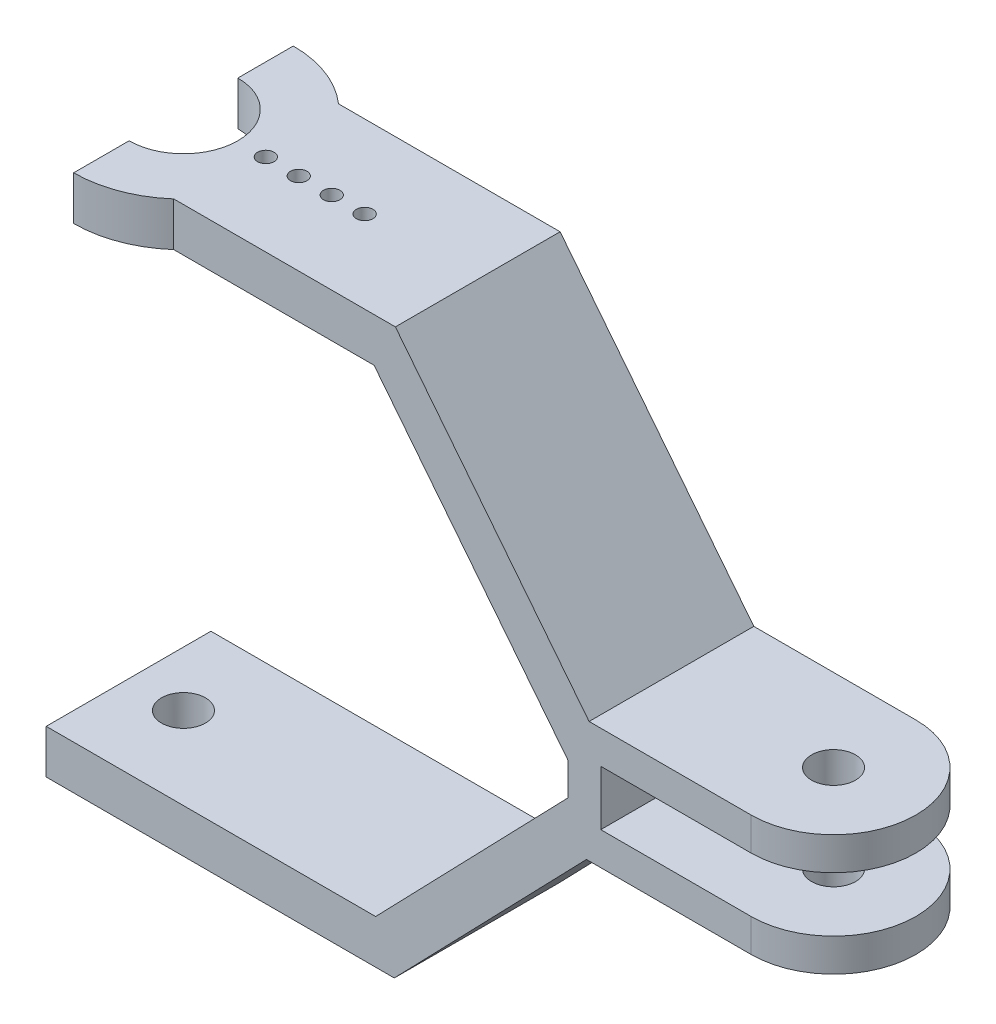
ISO-10303-21;
HEADER;
FILE_DESCRIPTION(('STEP AP214'),'2;1');
FILE_NAME('part.step','',(''),(''),'','','');
FILE_SCHEMA(('AUTOMOTIVE_DESIGN { 1 0 10303 214 1 1 1 1 }'));
ENDSEC;
DATA;
#1=APPLICATION_CONTEXT('core data for automotive mechanical design processes');
#2=APPLICATION_PROTOCOL_DEFINITION('international standard','automotive_design',2000,#1);
#3=PRODUCT_CONTEXT('',#1,'mechanical');
#4=PRODUCT('Part','Part','',(#3));
#5=PRODUCT_RELATED_PRODUCT_CATEGORY('part','',(#4));
#6=PRODUCT_DEFINITION_FORMATION('','',#4);
#7=PRODUCT_DEFINITION_CONTEXT('part definition',#1,'design');
#8=PRODUCT_DEFINITION('design','',#6,#7);
#9=PRODUCT_DEFINITION_SHAPE('','',#8);
#10=(LENGTH_UNIT() NAMED_UNIT(*) SI_UNIT(.MILLI.,.METRE.));
#11=(NAMED_UNIT(*) PLANE_ANGLE_UNIT() SI_UNIT($,.RADIAN.));
#12=(NAMED_UNIT(*) SI_UNIT($,.STERADIAN.) SOLID_ANGLE_UNIT());
#13=UNCERTAINTY_MEASURE_WITH_UNIT(LENGTH_MEASURE(1.E-05),#10,'distance_accuracy_value','');
#14=(GEOMETRIC_REPRESENTATION_CONTEXT(3) GLOBAL_UNCERTAINTY_ASSIGNED_CONTEXT((#13)) GLOBAL_UNIT_ASSIGNED_CONTEXT((#10,
#11,#12)) REPRESENTATION_CONTEXT('',''));
#15=CARTESIAN_POINT('',(0.,0.,0.));
#16=DIRECTION('',(0.,0.,1.));
#17=DIRECTION('',(1.,0.,0.));
#18=AXIS2_PLACEMENT_3D('',#15,#16,#17);
#19=CARTESIAN_POINT('',(-56.6964809757769,0.,15.));
#20=DIRECTION('',(1.,0.,0.));
#21=DIRECTION('',(0.,0.,-1.));
#22=AXIS2_PLACEMENT_3D('',#19,#20,#21);
#23=PLANE('',#22);
#24=DIRECTION('',(0.,-1.,0.));
#25=VECTOR('',#24,1.);
#26=CARTESIAN_POINT('',(-56.6964809757769,0.,0.));
#27=LINE('',#26,#25);
#28=CARTESIAN_POINT('',(-56.6964809757769,3.99999999999999,0.));
#29=VERTEX_POINT('',#28);
#30=CARTESIAN_POINT('',(-56.6964809757769,0.,0.));
#31=VERTEX_POINT('',#30);
#32=EDGE_CURVE('E184',#29,#31,#27,.T.);
#33=ORIENTED_EDGE('',*,*,#32,.T.);
#34=DIRECTION('',(0.,0.,-1.));
#35=VECTOR('',#34,1.);
#36=CARTESIAN_POINT('',(-56.6964809757769,0.,15.));
#37=LINE('',#36,#35);
#38=CARTESIAN_POINT('',(-56.6964809757769,0.,15.));
#39=VERTEX_POINT('',#38);
#40=EDGE_CURVE('E42',#39,#31,#37,.T.);
#41=ORIENTED_EDGE('',*,*,#40,.F.);
#42=DIRECTION('',(0.,-1.,0.));
#43=VECTOR('',#42,1.);
#44=CARTESIAN_POINT('',(-56.6964809757769,0.,15.));
#45=LINE('',#44,#43);
#46=CARTESIAN_POINT('',(-56.6964809757769,3.99999999999999,15.));
#47=VERTEX_POINT('',#46);
#48=EDGE_CURVE('E221',#47,#39,#45,.T.);
#49=ORIENTED_EDGE('',*,*,#48,.F.);
#50=DIRECTION('',(0.,0.,-1.));
#51=VECTOR('',#50,1.);
#52=CARTESIAN_POINT('',(-56.6964809757769,3.99999999999999,15.));
#53=LINE('',#52,#51);
#54=EDGE_CURVE('E180',#47,#29,#53,.T.);
#55=ORIENTED_EDGE('',*,*,#54,.T.);
#56=EDGE_LOOP('',(#33,#41,#49,#55));
#57=FACE_BOUND('',#56,.T.);
#58=ADVANCED_FACE('F35',(#57),#23,.F.);
#59=CARTESIAN_POINT('',(-25.,0.,15.));
#60=DIRECTION('',(0.,1.,0.));
#61=DIRECTION('',(-1.,0.,0.));
#62=AXIS2_PLACEMENT_3D('',#59,#60,#61);
#63=PLANE('',#62);
#64=CARTESIAN_POINT('',(-51.6964809757769,0.,7.5));
#65=DIRECTION('',(0.,-1.,0.));
#66=DIRECTION('',(1.,0.,0.));
#67=AXIS2_PLACEMENT_3D('',#64,#65,#66);
#68=CIRCLE('',#67,2.);
#69=CARTESIAN_POINT('',(-49.6964809757769,0.,7.5));
#70=VERTEX_POINT('',#69);
#71=EDGE_CURVE('E308',#70,#70,#68,.T.);
#72=ORIENTED_EDGE('',*,*,#71,.F.);
#73=EDGE_LOOP('',(#72));
#74=FACE_BOUND('',#73,.T.);
#75=DIRECTION('',(1.,0.,0.));
#76=VECTOR('',#75,1.);
#77=CARTESIAN_POINT('',(-25.,0.,0.));
#78=LINE('',#77,#76);
#79=CARTESIAN_POINT('',(-25.,0.,0.));
#80=VERTEX_POINT('',#79);
#81=EDGE_CURVE('E187',#31,#80,#78,.T.);
#82=ORIENTED_EDGE('',*,*,#81,.T.);
#83=DIRECTION('',(0.,0.,-1.));
#84=VECTOR('',#83,1.);
#85=CARTESIAN_POINT('',(-25.,0.,15.));
#86=LINE('',#85,#84);
#87=CARTESIAN_POINT('',(-25.,0.,15.));
#88=VERTEX_POINT('',#87);
#89=EDGE_CURVE('E243',#88,#80,#86,.T.);
#90=ORIENTED_EDGE('',*,*,#89,.F.);
#91=DIRECTION('',(1.,0.,0.));
#92=VECTOR('',#91,1.);
#93=CARTESIAN_POINT('',(-25.,0.,15.));
#94=LINE('',#93,#92);
#95=EDGE_CURVE('E115',#39,#88,#94,.T.);
#96=ORIENTED_EDGE('',*,*,#95,.F.);
#97=ORIENTED_EDGE('',*,*,#40,.T.);
#98=EDGE_LOOP('',(#82,#90,#96,#97));
#99=FACE_BOUND('',#98,.T.);
#100=ADVANCED_FACE('F246',(#74,#99),#63,.F.);
#101=CARTESIAN_POINT('',(-7.5,18.1,15.));
#102=DIRECTION('',(-0.718922211716419,0.695090536189907,0.));
#103=DIRECTION('',(-0.695090536189907,-0.718922211716419,0.));
#104=AXIS2_PLACEMENT_3D('',#101,#102,#103);
#105=PLANE('',#104);
#106=DIRECTION('',(0.695090536189907,0.718922211716419,0.));
#107=VECTOR('',#106,1.);
#108=CARTESIAN_POINT('',(-7.5,18.1,0.));
#109=LINE('',#108,#107);
#110=CARTESIAN_POINT('',(-7.5,18.1,0.));
#111=VERTEX_POINT('',#110);
#112=EDGE_CURVE('E190',#80,#111,#109,.T.);
#113=ORIENTED_EDGE('',*,*,#112,.T.);
#114=DIRECTION('',(0.,0.,-1.));
#115=VECTOR('',#114,1.);
#116=CARTESIAN_POINT('',(-7.5,18.1,15.));
#117=LINE('',#116,#115);
#118=CARTESIAN_POINT('',(-7.5,18.1,15.));
#119=VERTEX_POINT('',#118);
#120=EDGE_CURVE('E240',#119,#111,#117,.T.);
#121=ORIENTED_EDGE('',*,*,#120,.F.);
#122=DIRECTION('',(0.695090536189907,0.718922211716419,0.));
#123=VECTOR('',#122,1.);
#124=CARTESIAN_POINT('',(-7.5,18.1,15.));
#125=LINE('',#124,#123);
#126=EDGE_CURVE('E269',#88,#119,#125,.T.);
#127=ORIENTED_EDGE('',*,*,#126,.F.);
#128=ORIENTED_EDGE('',*,*,#89,.T.);
#129=EDGE_LOOP('',(#113,#121,#127,#128));
#130=FACE_BOUND('',#129,.T.);
#131=ADVANCED_FACE('F258',(#130),#105,.F.);
#132=CARTESIAN_POINT('',(-7.5,18.1,15.));
#133=DIRECTION('',(0.,1.,0.));
#134=DIRECTION('',(0.,0.,1.));
#135=AXIS2_PLACEMENT_3D('',#132,#133,#134);
#136=PLANE('',#135);
#137=CARTESIAN_POINT('',(7.50000000000001,18.1,7.5));
#138=DIRECTION('',(0.,1.,0.));
#139=DIRECTION('',(0.,0.,1.));
#140=AXIS2_PLACEMENT_3D('',#137,#138,#139);
#141=CIRCLE('',#140,2.);
#142=CARTESIAN_POINT('',(7.50000000000001,18.1,9.5));
#143=VERTEX_POINT('',#142);
#144=EDGE_CURVE('E327',#143,#143,#141,.T.);
#145=ORIENTED_EDGE('',*,*,#144,.T.);
#146=EDGE_LOOP('',(#145));
#147=FACE_BOUND('',#146,.T.);
#148=DIRECTION('',(1.,0.,0.));
#149=VECTOR('',#148,1.);
#150=CARTESIAN_POINT('',(-7.5,18.1,0.));
#151=LINE('',#150,#149);
#152=CARTESIAN_POINT('',(7.50000000000001,18.1,0.));
#153=VERTEX_POINT('',#152);
#154=EDGE_CURVE('E192',#111,#153,#151,.T.);
#155=ORIENTED_EDGE('',*,*,#154,.T.);
#156=CARTESIAN_POINT('',(7.50000000000001,18.1,7.5));
#157=DIRECTION('',(0.,-1.,0.));
#158=DIRECTION('',(0.,0.,-1.));
#159=AXIS2_PLACEMENT_3D('',#156,#157,#158);
#160=CIRCLE('',#159,7.5);
#161=CARTESIAN_POINT('',(7.50000000000001,18.1,15.));
#162=VERTEX_POINT('',#161);
#163=EDGE_CURVE('E266',#153,#162,#160,.T.);
#164=ORIENTED_EDGE('',*,*,#163,.T.);
#165=DIRECTION('',(1.,0.,0.));
#166=VECTOR('',#165,1.);
#167=CARTESIAN_POINT('',(-7.5,18.1,15.));
#168=LINE('',#167,#166);
#169=EDGE_CURVE('E264',#119,#162,#168,.T.);
#170=ORIENTED_EDGE('',*,*,#169,.F.);
#171=ORIENTED_EDGE('',*,*,#120,.T.);
#172=EDGE_LOOP('',(#155,#164,#170,#171));
#173=FACE_BOUND('',#172,.T.);
#174=ADVANCED_FACE('F262',(#147,#173),#136,.F.);
#175=CARTESIAN_POINT('',(7.50000000000001,21.1,15.));
#176=DIRECTION('',(0.,-1.,0.));
#177=DIRECTION('',(1.,0.,0.));
#178=AXIS2_PLACEMENT_3D('',#175,#176,#177);
#179=PLANE('',#178);
#180=CARTESIAN_POINT('',(7.50000000000001,21.1,7.5));
#181=DIRECTION('',(0.,-1.,0.));
#182=DIRECTION('',(1.,0.,0.));
#183=AXIS2_PLACEMENT_3D('',#180,#181,#182);
#184=CIRCLE('',#183,2.);
#185=CARTESIAN_POINT('',(9.50000000000001,21.1,7.5));
#186=VERTEX_POINT('',#185);
#187=EDGE_CURVE('E319',#186,#186,#184,.T.);
#188=ORIENTED_EDGE('',*,*,#187,.T.);
#189=EDGE_LOOP('',(#188));
#190=FACE_BOUND('',#189,.T.);
#191=DIRECTION('',(-1.,0.,0.));
#192=VECTOR('',#191,1.);
#193=CARTESIAN_POINT('',(7.50000000000001,21.1,15.));
#194=LINE('',#193,#192);
#195=CARTESIAN_POINT('',(7.50000000000001,21.1,15.));
#196=VERTEX_POINT('',#195);
#197=CARTESIAN_POINT('',(-6.19648097577692,21.1,15.));
#198=VERTEX_POINT('',#197);
#199=EDGE_CURVE('E271',#196,#198,#194,.T.);
#200=ORIENTED_EDGE('',*,*,#199,.F.);
#201=CARTESIAN_POINT('',(7.50000000000001,21.1,7.5));
#202=DIRECTION('',(0.,-1.,0.));
#203=DIRECTION('',(0.,0.,-1.));
#204=AXIS2_PLACEMENT_3D('',#201,#202,#203);
#205=CIRCLE('',#204,7.5);
#206=CARTESIAN_POINT('',(7.50000000000001,21.1,0.));
#207=VERTEX_POINT('',#206);
#208=EDGE_CURVE('E311',#207,#196,#205,.T.);
#209=ORIENTED_EDGE('',*,*,#208,.F.);
#210=DIRECTION('',(-1.,0.,0.));
#211=VECTOR('',#210,1.);
#212=CARTESIAN_POINT('',(7.50000000000001,21.1,0.));
#213=LINE('',#212,#211);
#214=CARTESIAN_POINT('',(-6.19648097577692,21.1,0.));
#215=VERTEX_POINT('',#214);
#216=EDGE_CURVE('E197',#207,#215,#213,.T.);
#217=ORIENTED_EDGE('',*,*,#216,.T.);
#218=DIRECTION('',(0.,0.,-1.));
#219=VECTOR('',#218,1.);
#220=CARTESIAN_POINT('',(-6.19648097577692,21.1,15.));
#221=LINE('',#220,#219);
#222=EDGE_CURVE('E237',#198,#215,#221,.T.);
#223=ORIENTED_EDGE('',*,*,#222,.F.);
#224=EDGE_LOOP('',(#200,#209,#217,#223));
#225=FACE_BOUND('',#224,.T.);
#226=ADVANCED_FACE('F462',(#190,#225),#179,.F.);
#227=CARTESIAN_POINT('',(-6.19648097577692,26.1,15.));
#228=DIRECTION('',(-1.,0.,0.));
#229=DIRECTION('',(0.,-1.,0.));
#230=AXIS2_PLACEMENT_3D('',#227,#228,#229);
#231=PLANE('',#230);
#232=DIRECTION('',(0.,1.,0.));
#233=VECTOR('',#232,1.);
#234=CARTESIAN_POINT('',(-6.19648097577692,26.1,0.));
#235=LINE('',#234,#233);
#236=CARTESIAN_POINT('',(-6.19648097577692,26.1,0.));
#237=VERTEX_POINT('',#236);
#238=EDGE_CURVE('E199',#215,#237,#235,.T.);
#239=ORIENTED_EDGE('',*,*,#238,.T.);
#240=DIRECTION('',(0.,0.,-1.));
#241=VECTOR('',#240,1.);
#242=CARTESIAN_POINT('',(-6.19648097577692,26.1,15.));
#243=LINE('',#242,#241);
#244=CARTESIAN_POINT('',(-6.19648097577692,26.1,15.));
#245=VERTEX_POINT('',#244);
#246=EDGE_CURVE('E234',#245,#237,#243,.T.);
#247=ORIENTED_EDGE('',*,*,#246,.F.);
#248=DIRECTION('',(0.,1.,0.));
#249=VECTOR('',#248,1.);
#250=CARTESIAN_POINT('',(-6.19648097577692,26.1,15.));
#251=LINE('',#250,#249);
#252=EDGE_CURVE('E277',#198,#245,#251,.T.);
#253=ORIENTED_EDGE('',*,*,#252,.F.);
#254=ORIENTED_EDGE('',*,*,#222,.T.);
#255=EDGE_LOOP('',(#239,#247,#253,#254));
#256=FACE_BOUND('',#255,.T.);
#257=ADVANCED_FACE('F468',(#256),#231,.F.);
#258=CARTESIAN_POINT('',(7.50000000000001,26.1,15.));
#259=DIRECTION('',(0.,1.,0.));
#260=DIRECTION('',(0.,0.,1.));
#261=AXIS2_PLACEMENT_3D('',#258,#259,#260);
#262=PLANE('',#261);
#263=CARTESIAN_POINT('',(7.50000000000001,26.1,7.5));
#264=DIRECTION('',(0.,1.,0.));
#265=DIRECTION('',(0.,0.,1.));
#266=AXIS2_PLACEMENT_3D('',#263,#264,#265);
#267=CIRCLE('',#266,2.);
#268=CARTESIAN_POINT('',(7.50000000000001,26.1,9.5));
#269=VERTEX_POINT('',#268);
#270=EDGE_CURVE('E324',#269,#269,#267,.T.);
#271=ORIENTED_EDGE('',*,*,#270,.T.);
#272=EDGE_LOOP('',(#271));
#273=FACE_BOUND('',#272,.T.);
#274=DIRECTION('',(1.,0.,0.));
#275=VECTOR('',#274,1.);
#276=CARTESIAN_POINT('',(7.50000000000001,26.1,0.));
#277=LINE('',#276,#275);
#278=CARTESIAN_POINT('',(7.50000000000001,26.1,0.));
#279=VERTEX_POINT('',#278);
#280=EDGE_CURVE('E201',#237,#279,#277,.T.);
#281=ORIENTED_EDGE('',*,*,#280,.T.);
#282=CARTESIAN_POINT('',(7.50000000000001,26.1,7.5));
#283=DIRECTION('',(0.,1.,0.));
#284=DIRECTION('',(0.,0.,1.));
#285=AXIS2_PLACEMENT_3D('',#282,#283,#284);
#286=CIRCLE('',#285,7.5);
#287=CARTESIAN_POINT('',(7.50000000000001,26.1,15.));
#288=VERTEX_POINT('',#287);
#289=EDGE_CURVE('E313',#288,#279,#286,.T.);
#290=ORIENTED_EDGE('',*,*,#289,.F.);
#291=DIRECTION('',(1.,0.,0.));
#292=VECTOR('',#291,1.);
#293=CARTESIAN_POINT('',(7.50000000000001,26.1,15.));
#294=LINE('',#293,#292);
#295=EDGE_CURVE('E279',#245,#288,#294,.T.);
#296=ORIENTED_EDGE('',*,*,#295,.F.);
#297=ORIENTED_EDGE('',*,*,#246,.T.);
#298=EDGE_LOOP('',(#281,#290,#296,#297));
#299=FACE_BOUND('',#298,.T.);
#300=ADVANCED_FACE('F471',(#273,#299),#262,.F.);
#301=CARTESIAN_POINT('',(-7.26033434363422,29.1,15.));
#302=DIRECTION('',(0.,-1.,0.));
#303=DIRECTION('',(0.,0.,-1.));
#304=AXIS2_PLACEMENT_3D('',#301,#302,#303);
#305=PLANE('',#304);
#306=CARTESIAN_POINT('',(7.50000000000001,29.1,7.5));
#307=DIRECTION('',(0.,1.,0.));
#308=DIRECTION('',(0.,0.,1.));
#309=AXIS2_PLACEMENT_3D('',#306,#307,#308);
#310=CIRCLE('',#309,2.);
#311=CARTESIAN_POINT('',(7.50000000000001,29.1,9.5));
#312=VERTEX_POINT('',#311);
#313=EDGE_CURVE('E328',#312,#312,#310,.T.);
#314=ORIENTED_EDGE('',*,*,#313,.F.);
#315=EDGE_LOOP('',(#314));
#316=FACE_BOUND('',#315,.T.);
#317=DIRECTION('',(-1.,0.,0.));
#318=VECTOR('',#317,1.);
#319=CARTESIAN_POINT('',(-7.26033434363422,29.1,15.));
#320=LINE('',#319,#318);
#321=CARTESIAN_POINT('',(7.50000000000001,29.1,15.));
#322=VERTEX_POINT('',#321);
#323=CARTESIAN_POINT('',(-7.26033434363422,29.1,15.));
#324=VERTEX_POINT('',#323);
#325=EDGE_CURVE('E283',#322,#324,#320,.T.);
#326=ORIENTED_EDGE('',*,*,#325,.F.);
#327=CARTESIAN_POINT('',(7.50000000000001,29.1,7.5));
#328=DIRECTION('',(0.,1.,0.));
#329=DIRECTION('',(0.,0.,1.));
#330=AXIS2_PLACEMENT_3D('',#327,#328,#329);
#331=CIRCLE('',#330,7.5);
#332=CARTESIAN_POINT('',(7.50000000000001,29.1,0.));
#333=VERTEX_POINT('',#332);
#334=EDGE_CURVE('E316',#322,#333,#331,.T.);
#335=ORIENTED_EDGE('',*,*,#334,.T.);
#336=DIRECTION('',(-1.,0.,0.));
#337=VECTOR('',#336,1.);
#338=CARTESIAN_POINT('',(-7.26033434363422,29.1,0.));
#339=LINE('',#338,#337);
#340=CARTESIAN_POINT('',(-7.26033434363422,29.1,0.));
#341=VERTEX_POINT('',#340);
#342=EDGE_CURVE('E206',#333,#341,#339,.T.);
#343=ORIENTED_EDGE('',*,*,#342,.T.);
#344=DIRECTION('',(0.,0.,-1.));
#345=VECTOR('',#344,1.);
#346=CARTESIAN_POINT('',(-7.26033434363422,29.1,15.));
#347=LINE('',#346,#345);
#348=EDGE_CURVE('E231',#324,#341,#347,.T.);
#349=ORIENTED_EDGE('',*,*,#348,.F.);
#350=EDGE_LOOP('',(#326,#335,#343,#349));
#351=FACE_BOUND('',#350,.T.);
#352=ADVANCED_FACE('F478',(#316,#351),#305,.F.);
#353=CARTESIAN_POINT('',(-24.8987709904648,51.4,15.));
#354=DIRECTION('',(-0.784314991068917,-0.620362792875721,0.));
#355=DIRECTION('',(0.620362792875721,-0.784314991068917,0.));
#356=AXIS2_PLACEMENT_3D('',#353,#354,#355);
#357=PLANE('',#356);
#358=DIRECTION('',(-0.620362792875721,0.784314991068917,0.));
#359=VECTOR('',#358,1.);
#360=CARTESIAN_POINT('',(-24.8987709904648,51.4,0.));
#361=LINE('',#360,#359);
#362=CARTESIAN_POINT('',(-24.8987709904648,51.4,0.));
#363=VERTEX_POINT('',#362);
#364=EDGE_CURVE('E208',#341,#363,#361,.T.);
#365=ORIENTED_EDGE('',*,*,#364,.T.);
#366=DIRECTION('',(0.,0.,-1.));
#367=VECTOR('',#366,1.);
#368=CARTESIAN_POINT('',(-24.8987709904648,51.4,15.));
#369=LINE('',#368,#367);
#370=CARTESIAN_POINT('',(-24.8987709904648,51.4,15.));
#371=VERTEX_POINT('',#370);
#372=EDGE_CURVE('E228',#371,#363,#369,.T.);
#373=ORIENTED_EDGE('',*,*,#372,.F.);
#374=DIRECTION('',(-0.620362792875721,0.784314991068917,0.));
#375=VECTOR('',#374,1.);
#376=CARTESIAN_POINT('',(-24.8987709904648,51.4,15.));
#377=LINE('',#376,#375);
#378=EDGE_CURVE('E285',#324,#371,#377,.T.);
#379=ORIENTED_EDGE('',*,*,#378,.F.);
#380=ORIENTED_EDGE('',*,*,#348,.T.);
#381=EDGE_LOOP('',(#365,#373,#379,#380));
#382=FACE_BOUND('',#381,.T.);
#383=ADVANCED_FACE('F405',(#382),#357,.F.);
#384=CARTESIAN_POINT('',(-24.8987709904648,51.4,15.));
#385=DIRECTION('',(0.,-1.,0.));
#386=DIRECTION('',(0.,0.,-1.));
#387=AXIS2_PLACEMENT_3D('',#384,#385,#386);
#388=PLANE('',#387);
#389=CARTESIAN_POINT('',(-41.1964809726075,51.4,7.5));
#390=DIRECTION('',(0.,1.,0.));
#391=DIRECTION('',(-1.,0.,0.));
#392=AXIS2_PLACEMENT_3D('',#389,#390,#391);
#393=CIRCLE('',#392,0.749999999999999);
#394=CARTESIAN_POINT('',(-41.9464809726075,51.4,7.5));
#395=VERTEX_POINT('',#394);
#396=EDGE_CURVE('E387',#395,#395,#393,.T.);
#397=ORIENTED_EDGE('',*,*,#396,.F.);
#398=EDGE_LOOP('',(#397));
#399=FACE_BOUND('',#398,.T.);
#400=CARTESIAN_POINT('',(-38.1964809726075,51.4,7.5));
#401=DIRECTION('',(0.,1.,0.));
#402=DIRECTION('',(-1.,0.,0.));
#403=AXIS2_PLACEMENT_3D('',#400,#401,#402);
#404=CIRCLE('',#403,0.749999999999999);
#405=CARTESIAN_POINT('',(-38.9464809726075,51.4,7.5));
#406=VERTEX_POINT('',#405);
#407=EDGE_CURVE('E381',#406,#406,#404,.T.);
#408=ORIENTED_EDGE('',*,*,#407,.F.);
#409=EDGE_LOOP('',(#408));
#410=FACE_BOUND('',#409,.T.);
#411=CARTESIAN_POINT('',(-35.1964809726075,51.4,7.5));
#412=DIRECTION('',(0.,1.,0.));
#413=DIRECTION('',(-1.,0.,0.));
#414=AXIS2_PLACEMENT_3D('',#411,#412,#413);
#415=CIRCLE('',#414,0.749999999999999);
#416=CARTESIAN_POINT('',(-35.9464809726075,51.4,7.5));
#417=VERTEX_POINT('',#416);
#418=EDGE_CURVE('E375',#417,#417,#415,.T.);
#419=ORIENTED_EDGE('',*,*,#418,.F.);
#420=EDGE_LOOP('',(#419));
#421=FACE_BOUND('',#420,.T.);
#422=CARTESIAN_POINT('',(-44.1964809726075,51.4,7.5));
#423=DIRECTION('',(0.,1.,0.));
#424=DIRECTION('',(-1.,0.,0.));
#425=AXIS2_PLACEMENT_3D('',#422,#423,#424);
#426=CIRCLE('',#425,0.749999999999999);
#427=CARTESIAN_POINT('',(-44.9464809726075,51.4,7.5));
#428=VERTEX_POINT('',#427);
#429=EDGE_CURVE('E369',#428,#428,#426,.T.);
#430=ORIENTED_EDGE('',*,*,#429,.F.);
#431=EDGE_LOOP('',(#430));
#432=FACE_BOUND('',#431,.T.);
#433=DIRECTION('',(-1.,0.,0.));
#434=VECTOR('',#433,1.);
#435=CARTESIAN_POINT('',(-24.8987709904648,51.4,0.));
#436=LINE('',#435,#434);
#437=CARTESIAN_POINT('',(-45.082102694946,51.4,0.));
#438=VERTEX_POINT('',#437);
#439=EDGE_CURVE('E210',#363,#438,#436,.T.);
#440=ORIENTED_EDGE('',*,*,#439,.T.);
#441=CARTESIAN_POINT('',(-51.6964809726075,51.4,7.5));
#442=DIRECTION('',(0.,1.,0.));
#443=DIRECTION('',(0.,0.,1.));
#444=AXIS2_PLACEMENT_3D('',#441,#442,#443);
#445=CIRCLE('',#444,10.);
#446=CARTESIAN_POINT('',(-51.6964809726075,51.4,-2.5));
#447=VERTEX_POINT('',#446);
#448=EDGE_CURVE('E357',#438,#447,#445,.T.);
#449=ORIENTED_EDGE('',*,*,#448,.T.);
#450=DIRECTION('',(0.,0.,1.));
#451=VECTOR('',#450,1.);
#452=CARTESIAN_POINT('',(-51.6964809726075,51.4,-2.5));
#453=LINE('',#452,#451);
#454=CARTESIAN_POINT('',(-51.6964809726075,51.4,2.55));
#455=VERTEX_POINT('',#454);
#456=EDGE_CURVE('E342',#447,#455,#453,.T.);
#457=ORIENTED_EDGE('',*,*,#456,.T.);
#458=CARTESIAN_POINT('',(-51.6964809726075,51.4,7.5));
#459=DIRECTION('',(0.,-1.,0.));
#460=DIRECTION('',(0.,0.,1.));
#461=AXIS2_PLACEMENT_3D('',#458,#459,#460);
#462=CIRCLE('',#461,4.95);
#463=CARTESIAN_POINT('',(-51.6964809726075,51.4,12.45));
#464=VERTEX_POINT('',#463);
#465=EDGE_CURVE('E361',#455,#464,#462,.T.);
#466=ORIENTED_EDGE('',*,*,#465,.T.);
#467=DIRECTION('',(0.,0.,1.));
#468=VECTOR('',#467,1.);
#469=CARTESIAN_POINT('',(-51.6964809726075,51.4,12.45));
#470=LINE('',#469,#468);
#471=CARTESIAN_POINT('',(-51.6964809726075,51.4,17.5));
#472=VERTEX_POINT('',#471);
#473=EDGE_CURVE('E358',#464,#472,#470,.T.);
#474=ORIENTED_EDGE('',*,*,#473,.T.);
#475=CARTESIAN_POINT('',(-45.082102694946,51.4,15.));
#476=VERTEX_POINT('',#475);
#477=EDGE_CURVE('E354',#472,#476,#445,.T.);
#478=ORIENTED_EDGE('',*,*,#477,.T.);
#479=DIRECTION('',(-1.,0.,0.));
#480=VECTOR('',#479,1.);
#481=CARTESIAN_POINT('',(-24.8987709904648,51.4,15.));
#482=LINE('',#481,#480);
#483=EDGE_CURVE('E287',#371,#476,#482,.T.);
#484=ORIENTED_EDGE('',*,*,#483,.F.);
#485=ORIENTED_EDGE('',*,*,#372,.T.);
#486=EDGE_LOOP('',(#440,#449,#457,#466,#474,#478,#484,#485));
#487=FACE_BOUND('',#486,.T.);
#488=ADVANCED_FACE('F402',(#399,#410,#421,#432,#487),#388,.F.);
#489=CARTESIAN_POINT('',(-46.7464809726075,47.4,15.));
#490=DIRECTION('',(0.,1.,0.));
#491=DIRECTION('',(0.,0.,1.));
#492=AXIS2_PLACEMENT_3D('',#489,#490,#491);
#493=PLANE('',#492);
#494=CARTESIAN_POINT('',(-51.6964809726075,47.4,7.5));
#495=DIRECTION('',(0.,1.,0.));
#496=DIRECTION('',(0.,0.,1.));
#497=AXIS2_PLACEMENT_3D('',#494,#495,#496);
#498=CIRCLE('',#497,4.95);
#499=CARTESIAN_POINT('',(-51.6964809726075,47.4,12.45));
#500=VERTEX_POINT('',#499);
#501=CARTESIAN_POINT('',(-51.6964809726075,47.4,2.55));
#502=VERTEX_POINT('',#501);
#503=EDGE_CURVE('E337',#500,#502,#498,.T.);
#504=ORIENTED_EDGE('',*,*,#503,.T.);
#505=DIRECTION('',(0.,0.,-1.));
#506=VECTOR('',#505,1.);
#507=CARTESIAN_POINT('',(-51.6964809726075,47.4,-2.5));
#508=LINE('',#507,#506);
#509=CARTESIAN_POINT('',(-51.6964809726075,47.4,-2.5));
#510=VERTEX_POINT('',#509);
#511=EDGE_CURVE('E366',#502,#510,#508,.T.);
#512=ORIENTED_EDGE('',*,*,#511,.T.);
#513=CARTESIAN_POINT('',(-51.6964809726075,47.4,7.5));
#514=DIRECTION('',(0.,1.,0.));
#515=DIRECTION('',(0.,0.,1.));
#516=AXIS2_PLACEMENT_3D('',#513,#514,#515);
#517=CIRCLE('',#516,10.);
#518=CARTESIAN_POINT('',(-45.082102694946,47.4,0.));
#519=VERTEX_POINT('',#518);
#520=EDGE_CURVE('E49',#510,#519,#517,.F.);
#521=ORIENTED_EDGE('',*,*,#520,.T.);
#522=DIRECTION('',(1.,0.,0.));
#523=VECTOR('',#522,1.);
#524=CARTESIAN_POINT('',(-46.7464809726075,47.4,0.));
#525=LINE('',#524,#523);
#526=CARTESIAN_POINT('',(-26.8349176226075,47.4,0.));
#527=VERTEX_POINT('',#526);
#528=EDGE_CURVE('E213',#519,#527,#525,.T.);
#529=ORIENTED_EDGE('',*,*,#528,.T.);
#530=DIRECTION('',(0.,0.,-1.));
#531=VECTOR('',#530,1.);
#532=CARTESIAN_POINT('',(-26.8349176226075,47.4,15.));
#533=LINE('',#532,#531);
#534=CARTESIAN_POINT('',(-26.8349176226075,47.4,15.));
#535=VERTEX_POINT('',#534);
#536=EDGE_CURVE('E225',#535,#527,#533,.T.);
#537=ORIENTED_EDGE('',*,*,#536,.F.);
#538=DIRECTION('',(1.,0.,0.));
#539=VECTOR('',#538,1.);
#540=CARTESIAN_POINT('',(-46.7464809726075,47.4,15.));
#541=LINE('',#540,#539);
#542=CARTESIAN_POINT('',(-45.082102694946,47.4,15.));
#543=VERTEX_POINT('',#542);
#544=EDGE_CURVE('E289',#543,#535,#541,.T.);
#545=ORIENTED_EDGE('',*,*,#544,.F.);
#546=CARTESIAN_POINT('',(-51.6964809726075,47.4,17.5));
#547=VERTEX_POINT('',#546);
#548=EDGE_CURVE('E351',#543,#547,#517,.F.);
#549=ORIENTED_EDGE('',*,*,#548,.T.);
#550=DIRECTION('',(0.,0.,-1.));
#551=VECTOR('',#550,1.);
#552=CARTESIAN_POINT('',(-51.6964809726075,47.4,12.45));
#553=LINE('',#552,#551);
#554=EDGE_CURVE('E334',#547,#500,#553,.T.);
#555=ORIENTED_EDGE('',*,*,#554,.T.);
#556=EDGE_LOOP('',(#504,#512,#521,#529,#537,#545,#549,#555));
#557=FACE_BOUND('',#556,.T.);
#558=ADVANCED_FACE('F298',(#557),#493,.F.);
#559=CARTESIAN_POINT('',(-16.9815707289928,34.9425673982795,15.));
#560=DIRECTION('',(0.784314991068917,0.620362792875721,0.));
#561=DIRECTION('',(-0.620362792875721,0.784314991068917,0.));
#562=AXIS2_PLACEMENT_3D('',#559,#560,#561);
#563=PLANE('',#562);
#564=DIRECTION('',(0.620362792875721,-0.784314991068917,0.));
#565=VECTOR('',#564,1.);
#566=CARTESIAN_POINT('',(-16.9815707289928,34.9425673982795,0.));
#567=LINE('',#566,#565);
#568=CARTESIAN_POINT('',(-9.19648097577691,25.1,0.));
#569=VERTEX_POINT('',#568);
#570=EDGE_CURVE('E215',#527,#569,#567,.T.);
#571=ORIENTED_EDGE('',*,*,#570,.T.);
#572=DIRECTION('',(0.,0.,-1.));
#573=VECTOR('',#572,1.);
#574=CARTESIAN_POINT('',(-9.19648097577691,25.1,15.));
#575=LINE('',#574,#573);
#576=CARTESIAN_POINT('',(-9.19648097577691,25.1,15.));
#577=VERTEX_POINT('',#576);
#578=EDGE_CURVE('E175',#577,#569,#575,.T.);
#579=ORIENTED_EDGE('',*,*,#578,.F.);
#580=DIRECTION('',(0.620362792875721,-0.784314991068917,0.));
#581=VECTOR('',#580,1.);
#582=CARTESIAN_POINT('',(-16.9815707289928,34.9425673982795,15.));
#583=LINE('',#582,#581);
#584=EDGE_CURVE('E162',#535,#577,#583,.T.);
#585=ORIENTED_EDGE('',*,*,#584,.F.);
#586=ORIENTED_EDGE('',*,*,#536,.T.);
#587=EDGE_LOOP('',(#571,#579,#585,#586));
#588=FACE_BOUND('',#587,.T.);
#589=ADVANCED_FACE('F302',(#588),#563,.F.);
#590=CARTESIAN_POINT('',(-9.19648097577691,25.1,15.));
#591=DIRECTION('',(1.,0.,0.));
#592=DIRECTION('',(0.,1.,0.));
#593=AXIS2_PLACEMENT_3D('',#590,#591,#592);
#594=PLANE('',#593);
#595=DIRECTION('',(0.,-1.,0.));
#596=VECTOR('',#595,1.);
#597=CARTESIAN_POINT('',(-9.19648097577691,25.1,0.));
#598=LINE('',#597,#596);
#599=CARTESIAN_POINT('',(-9.19648097577692,22.1,0.));
#600=VERTEX_POINT('',#599);
#601=EDGE_CURVE('E171',#569,#600,#598,.T.);
#602=ORIENTED_EDGE('',*,*,#601,.T.);
#603=DIRECTION('',(0.,0.,-1.));
#604=VECTOR('',#603,1.);
#605=CARTESIAN_POINT('',(-9.19648097577692,22.1,15.));
#606=LINE('',#605,#604);
#607=CARTESIAN_POINT('',(-9.19648097577692,22.1,15.));
#608=VERTEX_POINT('',#607);
#609=EDGE_CURVE('E168',#608,#600,#606,.T.);
#610=ORIENTED_EDGE('',*,*,#609,.F.);
#611=DIRECTION('',(0.,-1.,0.));
#612=VECTOR('',#611,1.);
#613=CARTESIAN_POINT('',(-9.19648097577691,25.1,15.));
#614=LINE('',#613,#612);
#615=EDGE_CURVE('E154',#577,#608,#614,.T.);
#616=ORIENTED_EDGE('',*,*,#615,.F.);
#617=ORIENTED_EDGE('',*,*,#578,.T.);
#618=EDGE_LOOP('',(#602,#610,#616,#617));
#619=FACE_BOUND('',#618,.T.);
#620=ADVANCED_FACE('F169',(#619),#594,.F.);
#621=CARTESIAN_POINT('',(-9.19648097577692,22.1,15.));
#622=DIRECTION('',(0.718922211716419,-0.695090536189907,0.));
#623=DIRECTION('',(0.695090536189907,0.718922211716419,0.));
#624=AXIS2_PLACEMENT_3D('',#621,#622,#623);
#625=PLANE('',#624);
#626=DIRECTION('',(-0.695090536189907,-0.718922211716419,0.));
#627=VECTOR('',#626,1.);
#628=CARTESIAN_POINT('',(-9.19648097577692,22.1,0.));
#629=LINE('',#628,#627);
#630=CARTESIAN_POINT('',(-26.6964809757769,4.,0.));
#631=VERTEX_POINT('',#630);
#632=EDGE_CURVE('E218',#600,#631,#629,.T.);
#633=ORIENTED_EDGE('',*,*,#632,.T.);
#634=DIRECTION('',(0.,0.,-1.));
#635=VECTOR('',#634,1.);
#636=CARTESIAN_POINT('',(-26.6964809757769,4.,15.));
#637=LINE('',#636,#635);
#638=CARTESIAN_POINT('',(-26.6964809757769,4.,15.));
#639=VERTEX_POINT('',#638);
#640=EDGE_CURVE('E176',#639,#631,#637,.T.);
#641=ORIENTED_EDGE('',*,*,#640,.F.);
#642=DIRECTION('',(-0.695090536189907,-0.718922211716419,0.));
#643=VECTOR('',#642,1.);
#644=CARTESIAN_POINT('',(-9.19648097577692,22.1,15.));
#645=LINE('',#644,#643);
#646=EDGE_CURVE('E159',#608,#639,#645,.T.);
#647=ORIENTED_EDGE('',*,*,#646,.F.);
#648=ORIENTED_EDGE('',*,*,#609,.T.);
#649=EDGE_LOOP('',(#633,#641,#647,#648));
#650=FACE_BOUND('',#649,.T.);
#651=ADVANCED_FACE('F178',(#650),#625,.F.);
#652=CARTESIAN_POINT('',(-56.6964809757769,3.99999999999999,15.));
#653=DIRECTION('',(0.,-1.,0.));
#654=DIRECTION('',(0.,0.,-1.));
#655=AXIS2_PLACEMENT_3D('',#652,#653,#654);
#656=PLANE('',#655);
#657=CARTESIAN_POINT('',(-51.6964809757769,3.99999999999999,7.5));
#658=DIRECTION('',(0.,-1.,0.));
#659=DIRECTION('',(0.,0.,-1.));
#660=AXIS2_PLACEMENT_3D('',#657,#658,#659);
#661=CIRCLE('',#660,2.);
#662=CARTESIAN_POINT('',(-51.6964809757769,3.99999999999999,5.5));
#663=VERTEX_POINT('',#662);
#664=EDGE_CURVE('E188',#663,#663,#661,.F.);
#665=ORIENTED_EDGE('',*,*,#664,.F.);
#666=EDGE_LOOP('',(#665));
#667=FACE_BOUND('',#666,.T.);
#668=DIRECTION('',(-1.,0.,0.));
#669=VECTOR('',#668,1.);
#670=CARTESIAN_POINT('',(-56.6964809757769,3.99999999999999,0.));
#671=LINE('',#670,#669);
#672=EDGE_CURVE('E106',#631,#29,#671,.T.);
#673=ORIENTED_EDGE('',*,*,#672,.T.);
#674=ORIENTED_EDGE('',*,*,#54,.F.);
#675=DIRECTION('',(-1.,0.,0.));
#676=VECTOR('',#675,1.);
#677=CARTESIAN_POINT('',(-26.6964809757769,4.,15.));
#678=LINE('',#677,#676);
#679=EDGE_CURVE('E57',#639,#47,#678,.T.);
#680=ORIENTED_EDGE('',*,*,#679,.F.);
#681=ORIENTED_EDGE('',*,*,#640,.T.);
#682=EDGE_LOOP('',(#673,#674,#680,#681));
#683=FACE_BOUND('',#682,.T.);
#684=ADVANCED_FACE('F303',(#667,#683),#656,.F.);
#685=CARTESIAN_POINT('',(0.,0.,15.));
#686=DIRECTION('',(0.,0.,-1.));
#687=DIRECTION('',(-1.,0.,0.));
#688=AXIS2_PLACEMENT_3D('',#685,#686,#687);
#689=PLANE('',#688);
#690=ORIENTED_EDGE('',*,*,#483,.T.);
#691=DIRECTION('',(0.,1.,0.));
#692=VECTOR('',#691,1.);
#693=CARTESIAN_POINT('',(-45.082102694946,25.0393202250021,15.));
#694=LINE('',#693,#692);
#695=EDGE_CURVE('E295',#476,#543,#694,.F.);
#696=ORIENTED_EDGE('',*,*,#695,.T.);
#697=ORIENTED_EDGE('',*,*,#544,.T.);
#698=ORIENTED_EDGE('',*,*,#584,.T.);
#699=ORIENTED_EDGE('',*,*,#615,.T.);
#700=ORIENTED_EDGE('',*,*,#646,.T.);
#701=ORIENTED_EDGE('',*,*,#679,.T.);
#702=ORIENTED_EDGE('',*,*,#48,.T.);
#703=ORIENTED_EDGE('',*,*,#95,.T.);
#704=ORIENTED_EDGE('',*,*,#126,.T.);
#705=ORIENTED_EDGE('',*,*,#169,.T.);
#706=DIRECTION('',(0.,1.,0.));
#707=VECTOR('',#706,1.);
#708=CARTESIAN_POINT('',(7.50000000000001,18.1,15.));
#709=LINE('',#708,#707);
#710=EDGE_CURVE('E268',#162,#196,#709,.T.);
#711=ORIENTED_EDGE('',*,*,#710,.T.);
#712=ORIENTED_EDGE('',*,*,#199,.T.);
#713=ORIENTED_EDGE('',*,*,#252,.T.);
#714=ORIENTED_EDGE('',*,*,#295,.T.);
#715=DIRECTION('',(0.,1.,0.));
#716=VECTOR('',#715,1.);
#717=CARTESIAN_POINT('',(7.50000000000001,26.1,15.));
#718=LINE('',#717,#716);
#719=EDGE_CURVE('E281',#288,#322,#718,.T.);
#720=ORIENTED_EDGE('',*,*,#719,.T.);
#721=ORIENTED_EDGE('',*,*,#325,.T.);
#722=ORIENTED_EDGE('',*,*,#378,.T.);
#723=EDGE_LOOP('',(#690,#696,#697,#698,#699,#700,#701,#702,#703,#704,#705,#711,#712,#713,#714,
#720,#721,#722));
#724=FACE_BOUND('',#723,.T.);
#725=ADVANCED_FACE('F157',(#724),#689,.F.);
#726=CARTESIAN_POINT('',(0.,0.,0.));
#727=DIRECTION('',(0.,0.,-1.));
#728=DIRECTION('',(-1.,0.,0.));
#729=AXIS2_PLACEMENT_3D('',#726,#727,#728);
#730=PLANE('',#729);
#731=DIRECTION('',(0.,1.,0.));
#732=VECTOR('',#731,1.);
#733=CARTESIAN_POINT('',(-45.082102694946,25.0393202250021,0.));
#734=LINE('',#733,#732);
#735=EDGE_CURVE('E11',#438,#519,#734,.F.);
#736=ORIENTED_EDGE('',*,*,#735,.F.);
#737=ORIENTED_EDGE('',*,*,#439,.F.);
#738=ORIENTED_EDGE('',*,*,#364,.F.);
#739=ORIENTED_EDGE('',*,*,#342,.F.);
#740=DIRECTION('',(0.,1.,0.));
#741=VECTOR('',#740,1.);
#742=CARTESIAN_POINT('',(7.50000000000001,26.1,0.));
#743=LINE('',#742,#741);
#744=EDGE_CURVE('E203',#279,#333,#743,.T.);
#745=ORIENTED_EDGE('',*,*,#744,.F.);
#746=ORIENTED_EDGE('',*,*,#280,.F.);
#747=ORIENTED_EDGE('',*,*,#238,.F.);
#748=ORIENTED_EDGE('',*,*,#216,.F.);
#749=DIRECTION('',(0.,1.,0.));
#750=VECTOR('',#749,1.);
#751=CARTESIAN_POINT('',(7.50000000000001,18.1,0.));
#752=LINE('',#751,#750);
#753=EDGE_CURVE('E194',#153,#207,#752,.T.);
#754=ORIENTED_EDGE('',*,*,#753,.F.);
#755=ORIENTED_EDGE('',*,*,#154,.F.);
#756=ORIENTED_EDGE('',*,*,#112,.F.);
#757=ORIENTED_EDGE('',*,*,#81,.F.);
#758=ORIENTED_EDGE('',*,*,#32,.F.);
#759=ORIENTED_EDGE('',*,*,#672,.F.);
#760=ORIENTED_EDGE('',*,*,#632,.F.);
#761=ORIENTED_EDGE('',*,*,#601,.F.);
#762=ORIENTED_EDGE('',*,*,#570,.F.);
#763=ORIENTED_EDGE('',*,*,#528,.F.);
#764=EDGE_LOOP('',(#736,#737,#738,#739,#745,#746,#747,#748,#754,#755,#756,#757,#758,#759,#760,
#761,#762,#763));
#765=FACE_BOUND('',#764,.T.);
#766=ADVANCED_FACE('F252',(#765),#730,.T.);
#767=CARTESIAN_POINT('',(-51.6964809757769,9.65685424949238,7.5));
#768=DIRECTION('',(0.,-1.,0.));
#769=DIRECTION('',(1.,0.,0.));
#770=AXIS2_PLACEMENT_3D('',#767,#768,#769);
#771=CYLINDRICAL_SURFACE('',#770,2.);
#772=ORIENTED_EDGE('',*,*,#664,.T.);
#773=EDGE_LOOP('',(#772));
#774=FACE_BOUND('',#773,.T.);
#775=ORIENTED_EDGE('',*,*,#71,.T.);
#776=EDGE_LOOP('',(#775));
#777=FACE_BOUND('',#776,.T.);
#778=ADVANCED_FACE('F545',(#774,#777),#771,.F.);
#779=CARTESIAN_POINT('',(7.50000000000001,21.1,7.5));
#780=DIRECTION('',(0.,-1.,0.));
#781=DIRECTION('',(0.,0.,-1.));
#782=AXIS2_PLACEMENT_3D('',#779,#780,#781);
#783=CYLINDRICAL_SURFACE('',#782,7.5);
#784=ORIENTED_EDGE('',*,*,#208,.T.);
#785=ORIENTED_EDGE('',*,*,#710,.F.);
#786=ORIENTED_EDGE('',*,*,#163,.F.);
#787=ORIENTED_EDGE('',*,*,#753,.T.);
#788=EDGE_LOOP('',(#784,#785,#786,#787));
#789=FACE_BOUND('',#788,.T.);
#790=ADVANCED_FACE('F460',(#789),#783,.T.);
#791=CARTESIAN_POINT('',(7.50000000000001,26.1,7.5));
#792=DIRECTION('',(0.,1.,0.));
#793=DIRECTION('',(0.,0.,1.));
#794=AXIS2_PLACEMENT_3D('',#791,#792,#793);
#795=CYLINDRICAL_SURFACE('',#794,7.5);
#796=ORIENTED_EDGE('',*,*,#719,.F.);
#797=ORIENTED_EDGE('',*,*,#289,.T.);
#798=ORIENTED_EDGE('',*,*,#744,.T.);
#799=ORIENTED_EDGE('',*,*,#334,.F.);
#800=EDGE_LOOP('',(#796,#797,#798,#799));
#801=FACE_BOUND('',#800,.T.);
#802=ADVANCED_FACE('F473',(#801),#795,.T.);
#803=CARTESIAN_POINT('',(7.50000000000001,18.1,7.5));
#804=DIRECTION('',(0.,1.,0.));
#805=DIRECTION('',(0.,0.,1.));
#806=AXIS2_PLACEMENT_3D('',#803,#804,#805);
#807=CYLINDRICAL_SURFACE('',#806,2.);
#808=ORIENTED_EDGE('',*,*,#313,.T.);
#809=EDGE_LOOP('',(#808));
#810=FACE_BOUND('',#809,.T.);
#811=ORIENTED_EDGE('',*,*,#270,.F.);
#812=EDGE_LOOP('',(#811));
#813=FACE_BOUND('',#812,.T.);
#814=ADVANCED_FACE('F501',(#810,#813),#807,.F.);
#815=ORIENTED_EDGE('',*,*,#144,.F.);
#816=EDGE_LOOP('',(#815));
#817=FACE_BOUND('',#816,.T.);
#818=ORIENTED_EDGE('',*,*,#187,.F.);
#819=EDGE_LOOP('',(#818));
#820=FACE_BOUND('',#819,.T.);
#821=ADVANCED_FACE('F494',(#817,#820),#807,.F.);
#822=CARTESIAN_POINT('',(-51.6964809726075,25.0393202250021,7.5));
#823=DIRECTION('',(0.,1.,0.));
#824=DIRECTION('',(0.,0.,1.));
#825=AXIS2_PLACEMENT_3D('',#822,#823,#824);
#826=CYLINDRICAL_SURFACE('',#825,4.95);
#827=DIRECTION('',(0.,1.,0.));
#828=VECTOR('',#827,1.);
#829=CARTESIAN_POINT('',(-51.6964809726075,25.0393202250021,2.55));
#830=LINE('',#829,#828);
#831=EDGE_CURVE('E348',#502,#455,#830,.T.);
#832=ORIENTED_EDGE('',*,*,#831,.F.);
#833=ORIENTED_EDGE('',*,*,#503,.F.);
#834=DIRECTION('',(0.,1.,0.));
#835=VECTOR('',#834,1.);
#836=CARTESIAN_POINT('',(-51.6964809726075,25.0393202250021,12.45));
#837=LINE('',#836,#835);
#838=EDGE_CURVE('E338',#500,#464,#837,.T.);
#839=ORIENTED_EDGE('',*,*,#838,.T.);
#840=ORIENTED_EDGE('',*,*,#465,.F.);
#841=EDGE_LOOP('',(#832,#833,#839,#840));
#842=FACE_BOUND('',#841,.T.);
#843=ADVANCED_FACE('F492',(#842),#826,.F.);
#844=CARTESIAN_POINT('',(-51.6964809726075,25.0393202250021,7.5));
#845=DIRECTION('',(0.,1.,0.));
#846=DIRECTION('',(0.,0.,1.));
#847=AXIS2_PLACEMENT_3D('',#844,#845,#846);
#848=CYLINDRICAL_SURFACE('',#847,10.);
#849=ORIENTED_EDGE('',*,*,#695,.F.);
#850=ORIENTED_EDGE('',*,*,#477,.F.);
#851=DIRECTION('',(0.,1.,0.));
#852=VECTOR('',#851,1.);
#853=CARTESIAN_POINT('',(-51.6964809726075,25.0393202250021,17.5));
#854=LINE('',#853,#852);
#855=EDGE_CURVE('E341',#547,#472,#854,.T.);
#856=ORIENTED_EDGE('',*,*,#855,.F.);
#857=ORIENTED_EDGE('',*,*,#548,.F.);
#858=EDGE_LOOP('',(#849,#850,#856,#857));
#859=FACE_BOUND('',#858,.T.);
#860=ADVANCED_FACE('F485',(#859),#848,.T.);
#861=CARTESIAN_POINT('',(-51.6964809726075,25.0393202250021,-2.5));
#862=DIRECTION('',(-1.,0.,0.));
#863=DIRECTION('',(0.,0.,1.));
#864=AXIS2_PLACEMENT_3D('',#861,#862,#863);
#865=PLANE('',#864);
#866=ORIENTED_EDGE('',*,*,#511,.F.);
#867=ORIENTED_EDGE('',*,*,#831,.T.);
#868=ORIENTED_EDGE('',*,*,#456,.F.);
#869=DIRECTION('',(0.,1.,0.));
#870=VECTOR('',#869,1.);
#871=CARTESIAN_POINT('',(-51.6964809726075,25.0393202250021,-2.5));
#872=LINE('',#871,#870);
#873=EDGE_CURVE('E345',#510,#447,#872,.T.);
#874=ORIENTED_EDGE('',*,*,#873,.F.);
#875=EDGE_LOOP('',(#866,#867,#868,#874));
#876=FACE_BOUND('',#875,.T.);
#877=ADVANCED_FACE('F435',(#876),#865,.T.);
#878=ORIENTED_EDGE('',*,*,#448,.F.);
#879=ORIENTED_EDGE('',*,*,#735,.T.);
#880=ORIENTED_EDGE('',*,*,#520,.F.);
#881=ORIENTED_EDGE('',*,*,#873,.T.);
#882=EDGE_LOOP('',(#878,#879,#880,#881));
#883=FACE_BOUND('',#882,.T.);
#884=ADVANCED_FACE('F426',(#883),#848,.T.);
#885=CARTESIAN_POINT('',(-51.6964809726075,25.0393202250021,12.45));
#886=DIRECTION('',(-1.,0.,0.));
#887=DIRECTION('',(0.,0.,1.));
#888=AXIS2_PLACEMENT_3D('',#885,#886,#887);
#889=PLANE('',#888);
#890=ORIENTED_EDGE('',*,*,#554,.F.);
#891=ORIENTED_EDGE('',*,*,#855,.T.);
#892=ORIENTED_EDGE('',*,*,#473,.F.);
#893=ORIENTED_EDGE('',*,*,#838,.F.);
#894=EDGE_LOOP('',(#890,#891,#892,#893));
#895=FACE_BOUND('',#894,.T.);
#896=ADVANCED_FACE('F489',(#895),#889,.T.);
#897=CARTESIAN_POINT('',(-44.1964809726075,48.4,7.5));
#898=DIRECTION('',(0.,1.,0.));
#899=DIRECTION('',(-1.,0.,0.));
#900=AXIS2_PLACEMENT_3D('',#897,#898,#899);
#901=CYLINDRICAL_SURFACE('',#900,0.749999999999999);
#902=CARTESIAN_POINT('',(-44.1964809726075,48.4,7.5));
#903=DIRECTION('',(0.,1.,0.));
#904=DIRECTION('',(-1.,0.,0.));
#905=AXIS2_PLACEMENT_3D('',#902,#903,#904);
#906=CIRCLE('',#905,0.749999999999999);
#907=CARTESIAN_POINT('',(-44.9464809726075,48.4,7.5));
#908=VERTEX_POINT('',#907);
#909=EDGE_CURVE('E364',#908,#908,#906,.T.);
#910=ORIENTED_EDGE('',*,*,#909,.F.);
#911=EDGE_LOOP('',(#910));
#912=FACE_BOUND('',#911,.T.);
#913=ORIENTED_EDGE('',*,*,#429,.T.);
#914=EDGE_LOOP('',(#913));
#915=FACE_BOUND('',#914,.T.);
#916=ADVANCED_FACE('F625',(#912,#915),#901,.F.);
#917=CARTESIAN_POINT('',(-44.1964809726075,48.4,7.5));
#918=DIRECTION('',(0.,1.,0.));
#919=DIRECTION('',(-1.,0.,0.));
#920=AXIS2_PLACEMENT_3D('',#917,#918,#919);
#921=PLANE('',#920);
#922=ORIENTED_EDGE('',*,*,#909,.T.);
#923=EDGE_LOOP('',(#922));
#924=FACE_BOUND('',#923,.T.);
#925=ADVANCED_FACE('F639',(#924),#921,.T.);
#926=CARTESIAN_POINT('',(-35.1964809726075,48.4,7.5));
#927=DIRECTION('',(0.,1.,0.));
#928=DIRECTION('',(-1.,0.,0.));
#929=AXIS2_PLACEMENT_3D('',#926,#927,#928);
#930=CYLINDRICAL_SURFACE('',#929,0.749999999999999);
#931=CARTESIAN_POINT('',(-35.1964809726075,48.4,7.5));
#932=DIRECTION('',(0.,1.,0.));
#933=DIRECTION('',(-1.,0.,0.));
#934=AXIS2_PLACEMENT_3D('',#931,#932,#933);
#935=CIRCLE('',#934,0.749999999999999);
#936=CARTESIAN_POINT('',(-35.9464809726075,48.4,7.5));
#937=VERTEX_POINT('',#936);
#938=EDGE_CURVE('E378',#937,#937,#935,.T.);
#939=ORIENTED_EDGE('',*,*,#938,.F.);
#940=EDGE_LOOP('',(#939));
#941=FACE_BOUND('',#940,.T.);
#942=ORIENTED_EDGE('',*,*,#418,.T.);
#943=EDGE_LOOP('',(#942));
#944=FACE_BOUND('',#943,.T.);
#945=ADVANCED_FACE('F649',(#941,#944),#930,.F.);
#946=CARTESIAN_POINT('',(-35.1964809726075,48.4,7.5));
#947=DIRECTION('',(0.,1.,0.));
#948=DIRECTION('',(-1.,0.,0.));
#949=AXIS2_PLACEMENT_3D('',#946,#947,#948);
#950=PLANE('',#949);
#951=ORIENTED_EDGE('',*,*,#938,.T.);
#952=EDGE_LOOP('',(#951));
#953=FACE_BOUND('',#952,.T.);
#954=ADVANCED_FACE('F659',(#953),#950,.T.);
#955=CARTESIAN_POINT('',(-38.1964809726075,48.4,7.5));
#956=DIRECTION('',(0.,1.,0.));
#957=DIRECTION('',(-1.,0.,0.));
#958=AXIS2_PLACEMENT_3D('',#955,#956,#957);
#959=CYLINDRICAL_SURFACE('',#958,0.749999999999999);
#960=CARTESIAN_POINT('',(-38.1964809726075,48.4,7.5));
#961=DIRECTION('',(0.,1.,0.));
#962=DIRECTION('',(-1.,0.,0.));
#963=AXIS2_PLACEMENT_3D('',#960,#961,#962);
#964=CIRCLE('',#963,0.749999999999999);
#965=CARTESIAN_POINT('',(-38.9464809726075,48.4,7.5));
#966=VERTEX_POINT('',#965);
#967=EDGE_CURVE('E384',#966,#966,#964,.T.);
#968=ORIENTED_EDGE('',*,*,#967,.F.);
#969=EDGE_LOOP('',(#968));
#970=FACE_BOUND('',#969,.T.);
#971=ORIENTED_EDGE('',*,*,#407,.T.);
#972=EDGE_LOOP('',(#971));
#973=FACE_BOUND('',#972,.T.);
#974=ADVANCED_FACE('F669',(#970,#973),#959,.F.);
#975=CARTESIAN_POINT('',(-38.1964809726075,48.4,7.5));
#976=DIRECTION('',(0.,1.,0.));
#977=DIRECTION('',(-1.,0.,0.));
#978=AXIS2_PLACEMENT_3D('',#975,#976,#977);
#979=PLANE('',#978);
#980=ORIENTED_EDGE('',*,*,#967,.T.);
#981=EDGE_LOOP('',(#980));
#982=FACE_BOUND('',#981,.T.);
#983=ADVANCED_FACE('F398',(#982),#979,.T.);
#984=CARTESIAN_POINT('',(-41.1964809726075,48.4,7.5));
#985=DIRECTION('',(0.,1.,0.));
#986=DIRECTION('',(-1.,0.,0.));
#987=AXIS2_PLACEMENT_3D('',#984,#985,#986);
#988=CYLINDRICAL_SURFACE('',#987,0.749999999999999);
#989=CARTESIAN_POINT('',(-41.1964809726075,48.4,7.5));
#990=DIRECTION('',(0.,1.,0.));
#991=DIRECTION('',(-1.,0.,0.));
#992=AXIS2_PLACEMENT_3D('',#989,#990,#991);
#993=CIRCLE('',#992,0.749999999999999);
#994=CARTESIAN_POINT('',(-41.9464809726075,48.4,7.5));
#995=VERTEX_POINT('',#994);
#996=EDGE_CURVE('E372',#995,#995,#993,.T.);
#997=ORIENTED_EDGE('',*,*,#996,.F.);
#998=EDGE_LOOP('',(#997));
#999=FACE_BOUND('',#998,.T.);
#1000=ORIENTED_EDGE('',*,*,#396,.T.);
#1001=EDGE_LOOP('',(#1000));
#1002=FACE_BOUND('',#1001,.T.);
#1003=ADVANCED_FACE('F395',(#999,#1002),#988,.F.);
#1004=CARTESIAN_POINT('',(-41.1964809726075,48.4,7.5));
#1005=DIRECTION('',(0.,1.,0.));
#1006=DIRECTION('',(-1.,0.,0.));
#1007=AXIS2_PLACEMENT_3D('',#1004,#1005,#1006);
#1008=PLANE('',#1007);
#1009=ORIENTED_EDGE('',*,*,#996,.T.);
#1010=EDGE_LOOP('',(#1009));
#1011=FACE_BOUND('',#1010,.T.);
#1012=ADVANCED_FACE('F393',(#1011),#1008,.T.);
#1013=CLOSED_SHELL('',(#58,#100,#131,#174,#226,#257,#300,#352,#383,#488,#558,#589,#620,#651,
#684,#725,#766,#778,#790,#802,#814,#821,#843,#860,#877,#884,#896,#916,#925,#945,#954,#974,#983,
#1003,#1012));
#1014=MANIFOLD_SOLID_BREP('B2',#1013);
#1015=ADVANCED_BREP_SHAPE_REPRESENTATION('',(#18,#1014),#14);
#1016=SHAPE_DEFINITION_REPRESENTATION(#9,#1015);
ENDSEC;
END-ISO-10303-21;
